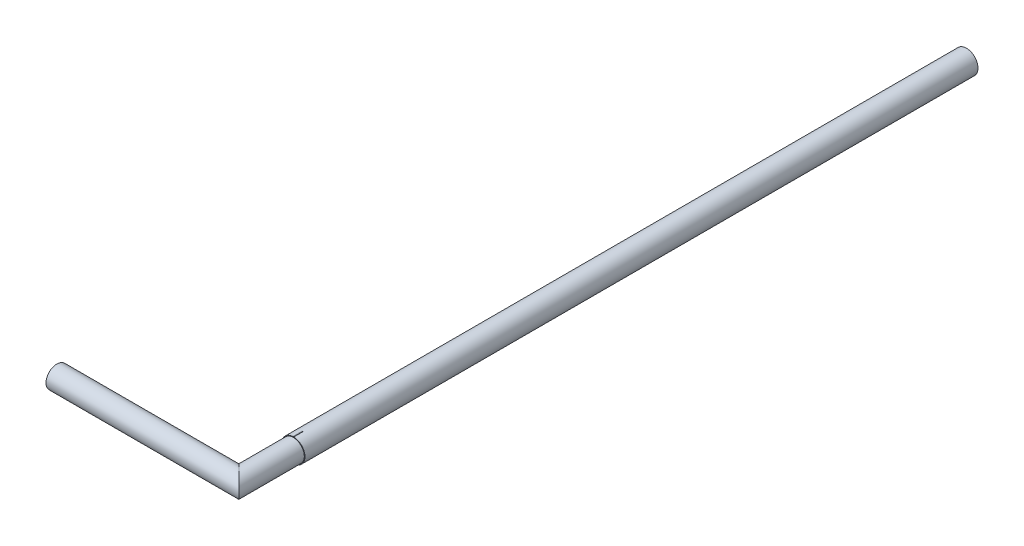
ISO-10303-21;
HEADER;
FILE_DESCRIPTION(('STEP AP214'),'2;1');
FILE_NAME('part.step','',(''),(''),'','','');
FILE_SCHEMA(('AUTOMOTIVE_DESIGN { 1 0 10303 214 1 1 1 1 }'));
ENDSEC;
DATA;
#1=APPLICATION_CONTEXT('core data for automotive mechanical design processes');
#2=APPLICATION_PROTOCOL_DEFINITION('international standard','automotive_design',2000,#1);
#3=PRODUCT_CONTEXT('',#1,'mechanical');
#4=PRODUCT('Part','Part','',(#3));
#5=PRODUCT_RELATED_PRODUCT_CATEGORY('part','',(#4));
#6=PRODUCT_DEFINITION_FORMATION('','',#4);
#7=PRODUCT_DEFINITION_CONTEXT('part definition',#1,'design');
#8=PRODUCT_DEFINITION('design','',#6,#7);
#9=PRODUCT_DEFINITION_SHAPE('','',#8);
#10=(LENGTH_UNIT() NAMED_UNIT(*) SI_UNIT(.MILLI.,.METRE.));
#11=(NAMED_UNIT(*) PLANE_ANGLE_UNIT() SI_UNIT($,.RADIAN.));
#12=(NAMED_UNIT(*) SI_UNIT($,.STERADIAN.) SOLID_ANGLE_UNIT());
#13=UNCERTAINTY_MEASURE_WITH_UNIT(LENGTH_MEASURE(1.E-05),#10,'distance_accuracy_value','');
#14=(GEOMETRIC_REPRESENTATION_CONTEXT(3) GLOBAL_UNCERTAINTY_ASSIGNED_CONTEXT((#13)) GLOBAL_UNIT_ASSIGNED_CONTEXT((#10,
#11,#12)) REPRESENTATION_CONTEXT('',''));
#15=CARTESIAN_POINT('',(0.,0.,0.));
#16=DIRECTION('',(0.,0.,1.));
#17=DIRECTION('',(1.,0.,0.));
#18=AXIS2_PLACEMENT_3D('',#15,#16,#17);
#19=CARTESIAN_POINT('',(0.,0.,740.));
#20=DIRECTION('',(0.,0.,-1.));
#21=DIRECTION('',(-1.,0.,0.));
#22=AXIS2_PLACEMENT_3D('',#19,#20,#21);
#23=CYLINDRICAL_SURFACE('',#22,12.7);
#24=CARTESIAN_POINT('',(0.,0.,730.));
#25=DIRECTION('',(0.,0.,-1.));
#26=DIRECTION('',(-1.,0.,0.));
#27=AXIS2_PLACEMENT_3D('',#24,#25,#26);
#28=CIRCLE('',#27,12.7);
#29=CARTESIAN_POINT('',(-0.388583215929212,12.6940538475421,730.));
#30=VERTEX_POINT('',#29);
#31=CARTESIAN_POINT('',(0.388583215929212,12.6940538475421,730.));
#32=VERTEX_POINT('',#31);
#33=EDGE_CURVE('E42',#30,#32,#28,.T.);
#34=ORIENTED_EDGE('',*,*,#33,.T.);
#35=DIRECTION('',(0.,0.,-1.));
#36=VECTOR('',#35,1.);
#37=CARTESIAN_POINT('',(0.388583215929212,12.6940538475421,740.));
#38=LINE('',#37,#36);
#39=CARTESIAN_POINT('',(0.388583215929212,12.6940538475421,740.));
#40=VERTEX_POINT('',#39);
#41=EDGE_CURVE('E57',#32,#40,#38,.F.);
#42=ORIENTED_EDGE('',*,*,#41,.T.);
#43=CARTESIAN_POINT('',(0.,0.,740.));
#44=DIRECTION('',(0.,0.,1.));
#45=DIRECTION('',(1.,0.,0.));
#46=AXIS2_PLACEMENT_3D('',#43,#44,#45);
#47=CIRCLE('',#46,12.7);
#48=CARTESIAN_POINT('',(-0.388583215929212,12.6940538475421,740.));
#49=VERTEX_POINT('',#48);
#50=EDGE_CURVE('E113',#49,#40,#47,.T.);
#51=ORIENTED_EDGE('',*,*,#50,.F.);
#52=DIRECTION('',(0.,0.,-1.));
#53=VECTOR('',#52,1.);
#54=CARTESIAN_POINT('',(-0.388583215929212,12.6940538475421,740.));
#55=LINE('',#54,#53);
#56=EDGE_CURVE('E106',#49,#30,#55,.T.);
#57=ORIENTED_EDGE('',*,*,#56,.T.);
#58=EDGE_LOOP('',(#34,#42,#51,#57));
#59=FACE_BOUND('',#58,.T.);
#60=CARTESIAN_POINT('',(0.,0.,0.));
#61=DIRECTION('',(0.,0.,1.));
#62=DIRECTION('',(1.,0.,0.));
#63=AXIS2_PLACEMENT_3D('',#60,#61,#62);
#64=CIRCLE('',#63,12.7);
#65=CARTESIAN_POINT('',(12.7,0.,0.));
#66=VERTEX_POINT('',#65);
#67=EDGE_CURVE('E112',#66,#66,#64,.T.);
#68=ORIENTED_EDGE('',*,*,#67,.T.);
#69=EDGE_LOOP('',(#68));
#70=FACE_BOUND('',#69,.T.);
#71=ADVANCED_FACE('F35',(#59,#70),#23,.T.);
#72=CARTESIAN_POINT('',(0.,0.,740.));
#73=DIRECTION('',(0.,0.,1.));
#74=DIRECTION('',(1.,0.,0.));
#75=AXIS2_PLACEMENT_3D('',#72,#73,#74);
#76=PLANE('',#75);
#77=CARTESIAN_POINT('',(0.,0.,740.));
#78=DIRECTION('',(0.,0.,1.));
#79=DIRECTION('',(1.,0.,0.));
#80=AXIS2_PLACEMENT_3D('',#77,#78,#79);
#81=CIRCLE('',#80,12.);
#82=CARTESIAN_POINT('',(12.,0.,740.));
#83=VERTEX_POINT('',#82);
#84=EDGE_CURVE('E11',#83,#83,#81,.T.);
#85=ORIENTED_EDGE('',*,*,#84,.F.);
#86=EDGE_LOOP('',(#85));
#87=FACE_BOUND('',#86,.T.);
#88=ORIENTED_EDGE('',*,*,#50,.T.);
#89=DIRECTION('',(0.,1.,0.));
#90=VECTOR('',#89,1.);
#91=CARTESIAN_POINT('',(0.388583215929212,12.4119498696964,740.));
#92=LINE('',#91,#90);
#93=CARTESIAN_POINT('',(0.388583215929212,12.9880501303036,740.));
#94=VERTEX_POINT('',#93);
#95=EDGE_CURVE('E86',#40,#94,#92,.T.);
#96=ORIENTED_EDGE('',*,*,#95,.T.);
#97=DIRECTION('',(-1.,0.,0.));
#98=VECTOR('',#97,1.);
#99=CARTESIAN_POINT('',(-0.388583215929212,12.9880501303036,740.));
#100=LINE('',#99,#98);
#101=CARTESIAN_POINT('',(-0.388583215929212,12.9880501303036,740.));
#102=VERTEX_POINT('',#101);
#103=EDGE_CURVE('E89',#94,#102,#100,.T.);
#104=ORIENTED_EDGE('',*,*,#103,.T.);
#105=DIRECTION('',(0.,-1.,0.));
#106=VECTOR('',#105,1.);
#107=CARTESIAN_POINT('',(-0.388583215929212,12.4119498696964,740.));
#108=LINE('',#107,#106);
#109=EDGE_CURVE('E49',#102,#49,#108,.T.);
#110=ORIENTED_EDGE('',*,*,#109,.T.);
#111=EDGE_LOOP('',(#88,#96,#104,#110));
#112=FACE_BOUND('',#111,.T.);
#113=ADVANCED_FACE('F131',(#87,#112),#76,.T.);
#114=CARTESIAN_POINT('',(0.,0.,0.));
#115=DIRECTION('',(0.,0.,1.));
#116=DIRECTION('',(1.,0.,0.));
#117=AXIS2_PLACEMENT_3D('',#114,#115,#116);
#118=PLANE('',#117);
#119=ORIENTED_EDGE('',*,*,#67,.F.);
#120=EDGE_LOOP('',(#119));
#121=FACE_BOUND('',#120,.T.);
#122=ADVANCED_FACE('F133',(#121),#118,.F.);
#123=CARTESIAN_POINT('',(0.388583215929212,12.4119498696964,730.));
#124=DIRECTION('',(1.,0.,0.));
#125=DIRECTION('',(0.,0.,-1.));
#126=AXIS2_PLACEMENT_3D('',#123,#124,#125);
#127=PLANE('',#126);
#128=ORIENTED_EDGE('',*,*,#41,.F.);
#129=DIRECTION('',(0.,1.,0.));
#130=VECTOR('',#129,1.);
#131=CARTESIAN_POINT('',(0.388583215929212,12.4119498696964,730.));
#132=LINE('',#131,#130);
#133=CARTESIAN_POINT('',(0.388583215929212,12.9880501303036,730.));
#134=VERTEX_POINT('',#133);
#135=EDGE_CURVE('E93',#32,#134,#132,.T.);
#136=ORIENTED_EDGE('',*,*,#135,.T.);
#137=DIRECTION('',(0.,0.,1.));
#138=VECTOR('',#137,1.);
#139=CARTESIAN_POINT('',(0.388583215929212,12.9880501303036,730.));
#140=LINE('',#139,#138);
#141=EDGE_CURVE('E100',#134,#94,#140,.T.);
#142=ORIENTED_EDGE('',*,*,#141,.T.);
#143=ORIENTED_EDGE('',*,*,#95,.F.);
#144=EDGE_LOOP('',(#128,#136,#142,#143));
#145=FACE_BOUND('',#144,.T.);
#146=ADVANCED_FACE('F130',(#145),#127,.T.);
#147=CARTESIAN_POINT('',(-0.388583215929212,12.4119498696964,730.));
#148=DIRECTION('',(-1.,0.,0.));
#149=DIRECTION('',(0.,0.,1.));
#150=AXIS2_PLACEMENT_3D('',#147,#148,#149);
#151=PLANE('',#150);
#152=ORIENTED_EDGE('',*,*,#56,.F.);
#153=ORIENTED_EDGE('',*,*,#109,.F.);
#154=DIRECTION('',(0.,0.,1.));
#155=VECTOR('',#154,1.);
#156=CARTESIAN_POINT('',(-0.388583215929212,12.9880501303036,730.));
#157=LINE('',#156,#155);
#158=CARTESIAN_POINT('',(-0.388583215929212,12.9880501303036,730.));
#159=VERTEX_POINT('',#158);
#160=EDGE_CURVE('E104',#159,#102,#157,.T.);
#161=ORIENTED_EDGE('',*,*,#160,.F.);
#162=DIRECTION('',(0.,-1.,0.));
#163=VECTOR('',#162,1.);
#164=CARTESIAN_POINT('',(-0.388583215929212,12.4119498696964,730.));
#165=LINE('',#164,#163);
#166=EDGE_CURVE('E98',#159,#30,#165,.T.);
#167=ORIENTED_EDGE('',*,*,#166,.T.);
#168=EDGE_LOOP('',(#152,#153,#161,#167));
#169=FACE_BOUND('',#168,.T.);
#170=ADVANCED_FACE('F125',(#169),#151,.T.);
#171=CARTESIAN_POINT('',(-0.388583215929212,12.9880501303036,730.));
#172=DIRECTION('',(0.,1.,0.));
#173=DIRECTION('',(0.,0.,1.));
#174=AXIS2_PLACEMENT_3D('',#171,#172,#173);
#175=PLANE('',#174);
#176=ORIENTED_EDGE('',*,*,#103,.F.);
#177=ORIENTED_EDGE('',*,*,#141,.F.);
#178=DIRECTION('',(-1.,0.,0.));
#179=VECTOR('',#178,1.);
#180=CARTESIAN_POINT('',(-0.388583215929212,12.9880501303036,730.));
#181=LINE('',#180,#179);
#182=EDGE_CURVE('E95',#134,#159,#181,.T.);
#183=ORIENTED_EDGE('',*,*,#182,.T.);
#184=ORIENTED_EDGE('',*,*,#160,.T.);
#185=EDGE_LOOP('',(#176,#177,#183,#184));
#186=FACE_BOUND('',#185,.T.);
#187=ADVANCED_FACE('F128',(#186),#175,.T.);
#188=CARTESIAN_POINT('',(0.,0.,730.));
#189=DIRECTION('',(0.,0.,-1.));
#190=DIRECTION('',(-1.,0.,0.));
#191=AXIS2_PLACEMENT_3D('',#188,#189,#190);
#192=PLANE('',#191);
#193=ORIENTED_EDGE('',*,*,#33,.F.);
#194=ORIENTED_EDGE('',*,*,#166,.F.);
#195=ORIENTED_EDGE('',*,*,#182,.F.);
#196=ORIENTED_EDGE('',*,*,#135,.F.);
#197=EDGE_LOOP('',(#193,#194,#195,#196));
#198=FACE_BOUND('',#197,.T.);
#199=ADVANCED_FACE('F122',(#198),#192,.T.);
#200=CARTESIAN_POINT('',(-200.,0.,800.));
#201=DIRECTION('',(-1.,0.,0.));
#202=DIRECTION('',(0.,0.,1.));
#203=AXIS2_PLACEMENT_3D('',#200,#201,#202);
#204=PLANE('',#203);
#205=CARTESIAN_POINT('',(-200.,0.,800.));
#206=DIRECTION('',(-1.,0.,0.));
#207=DIRECTION('',(0.,0.,1.));
#208=AXIS2_PLACEMENT_3D('',#205,#206,#207);
#209=CIRCLE('',#208,12.);
#210=CARTESIAN_POINT('',(-200.,0.,812.));
#211=VERTEX_POINT('',#210);
#212=EDGE_CURVE('E87',#211,#211,#209,.T.);
#213=ORIENTED_EDGE('',*,*,#212,.T.);
#214=EDGE_LOOP('',(#213));
#215=FACE_BOUND('',#214,.T.);
#216=ADVANCED_FACE('F151',(#215),#204,.T.);
#217=CARTESIAN_POINT('',(13.2999999999999,0.,800.));
#218=DIRECTION('',(-1.,0.,0.));
#219=DIRECTION('',(0.,0.,1.));
#220=AXIS2_PLACEMENT_3D('',#217,#218,#219);
#221=CYLINDRICAL_SURFACE('',#220,12.);
#222=CARTESIAN_POINT('',(0.,0.,800.));
#223=DIRECTION('',(-0.707106781186548,0.,0.707106781186548));
#224=DIRECTION('',(0.707106781186548,0.,0.707106781186548));
#225=AXIS2_PLACEMENT_3D('',#222,#223,#224);
#226=ELLIPSE('',#225,16.9705627484771,12.);
#227=CARTESIAN_POINT('',(12.,0.,812.));
#228=VERTEX_POINT('',#227);
#229=EDGE_CURVE('E82',#228,#228,#226,.F.);
#230=ORIENTED_EDGE('',*,*,#229,.F.);
#231=EDGE_LOOP('',(#230));
#232=FACE_BOUND('',#231,.T.);
#233=ORIENTED_EDGE('',*,*,#212,.F.);
#234=EDGE_LOOP('',(#233));
#235=FACE_BOUND('',#234,.T.);
#236=ADVANCED_FACE('F83',(#232,#235),#221,.T.);
#237=CARTESIAN_POINT('',(0.,0.,740.));
#238=DIRECTION('',(0.,0.,1.));
#239=DIRECTION('',(1.,0.,0.));
#240=AXIS2_PLACEMENT_3D('',#237,#238,#239);
#241=CYLINDRICAL_SURFACE('',#240,12.);
#242=ORIENTED_EDGE('',*,*,#84,.T.);
#243=EDGE_LOOP('',(#242));
#244=FACE_BOUND('',#243,.T.);
#245=ORIENTED_EDGE('',*,*,#229,.T.);
#246=EDGE_LOOP('',(#245));
#247=FACE_BOUND('',#246,.T.);
#248=ADVANCED_FACE('F152',(#244,#247),#241,.T.);
#249=CLOSED_SHELL('',(#71,#113,#122,#146,#170,#187,#199,#216,#236,#248));
#250=MANIFOLD_SOLID_BREP('B2',#249);
#251=ADVANCED_BREP_SHAPE_REPRESENTATION('',(#18,#250),#14);
#252=SHAPE_DEFINITION_REPRESENTATION(#9,#251);
ENDSEC;
END-ISO-10303-21;
